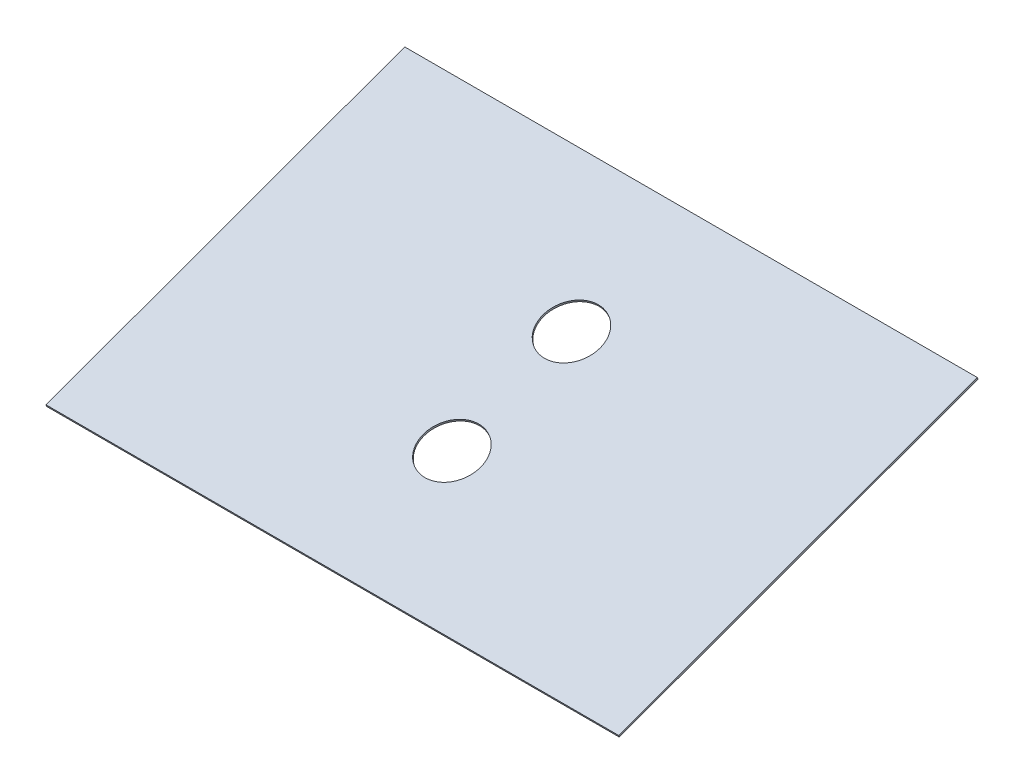
ISO-10303-21;
HEADER;
FILE_DESCRIPTION(('STEP AP214'),'2;1');
FILE_NAME('part.step','',(''),(''),'','','');
FILE_SCHEMA(('AUTOMOTIVE_DESIGN { 1 0 10303 214 1 1 1 1 }'));
ENDSEC;
DATA;
#1=APPLICATION_CONTEXT('core data for automotive mechanical design processes');
#2=APPLICATION_PROTOCOL_DEFINITION('international standard','automotive_design',2000,#1);
#3=PRODUCT_CONTEXT('',#1,'mechanical');
#4=PRODUCT('Part','Part','',(#3));
#5=PRODUCT_RELATED_PRODUCT_CATEGORY('part','',(#4));
#6=PRODUCT_DEFINITION_FORMATION('','',#4);
#7=PRODUCT_DEFINITION_CONTEXT('part definition',#1,'design');
#8=PRODUCT_DEFINITION('design','',#6,#7);
#9=PRODUCT_DEFINITION_SHAPE('','',#8);
#10=(LENGTH_UNIT() NAMED_UNIT(*) SI_UNIT(.MILLI.,.METRE.));
#11=(NAMED_UNIT(*) PLANE_ANGLE_UNIT() SI_UNIT($,.RADIAN.));
#12=(NAMED_UNIT(*) SI_UNIT($,.STERADIAN.) SOLID_ANGLE_UNIT());
#13=UNCERTAINTY_MEASURE_WITH_UNIT(LENGTH_MEASURE(1.E-05),#10,'distance_accuracy_value','');
#14=(GEOMETRIC_REPRESENTATION_CONTEXT(3) GLOBAL_UNCERTAINTY_ASSIGNED_CONTEXT((#13)) GLOBAL_UNIT_ASSIGNED_CONTEXT((#10,
#11,#12)) REPRESENTATION_CONTEXT('',''));
#15=CARTESIAN_POINT('',(0.,0.,0.));
#16=DIRECTION('',(0.,0.,1.));
#17=DIRECTION('',(1.,0.,0.));
#18=AXIS2_PLACEMENT_3D('',#15,#16,#17);
#19=CARTESIAN_POINT('',(0.,-22.480622248936,26.2341140516415));
#20=DIRECTION('',(-1.,0.,0.));
#21=DIRECTION('',(0.,0.342020143325666,-0.939692620785909));
#22=AXIS2_PLACEMENT_3D('',#19,#20,#21);
#23=PLANE('',#22);
#24=DIRECTION('',(0.,-0.939692620785909,-0.342020143325666));
#25=VECTOR('',#24,1.);
#26=CARTESIAN_POINT('',(0.,-29.3210251154493,45.0279664673597));
#27=LINE('',#26,#25);
#28=CARTESIAN_POINT('',(0.,-29.2270558533707,45.0621684816922));
#29=VERTEX_POINT('',#28);
#30=CARTESIAN_POINT('',(0.,-29.3210251154493,45.0279664673597));
#31=VERTEX_POINT('',#30);
#32=EDGE_CURVE('E11',#29,#31,#27,.T.);
#33=ORIENTED_EDGE('',*,*,#32,.F.);
#34=DIRECTION('',(0.,0.342020143325666,-0.939692620785909));
#35=VECTOR('',#34,1.);
#36=CARTESIAN_POINT('',(0.,-22.3866529868574,26.268316065974));
#37=LINE('',#36,#35);
#38=CARTESIAN_POINT('',(0.,-22.3866529868574,26.268316065974));
#39=VERTEX_POINT('',#38);
#40=EDGE_CURVE('E88',#29,#39,#37,.T.);
#41=ORIENTED_EDGE('',*,*,#40,.T.);
#42=DIRECTION('',(0.,-0.939692620785909,-0.342020143325666));
#43=VECTOR('',#42,1.);
#44=CARTESIAN_POINT('',(0.,-22.480622248936,26.2341140516415));
#45=LINE('',#44,#43);
#46=CARTESIAN_POINT('',(0.,-22.480622248936,26.2341140516415));
#47=VERTEX_POINT('',#46);
#48=EDGE_CURVE('E43',#39,#47,#45,.T.);
#49=ORIENTED_EDGE('',*,*,#48,.T.);
#50=DIRECTION('',(0.,0.342020143325666,-0.939692620785909));
#51=VECTOR('',#50,1.);
#52=CARTESIAN_POINT('',(0.,-22.480622248936,26.2341140516415));
#53=LINE('',#52,#51);
#54=EDGE_CURVE('E105',#31,#47,#53,.T.);
#55=ORIENTED_EDGE('',*,*,#54,.F.);
#56=EDGE_LOOP('',(#33,#41,#49,#55));
#57=FACE_BOUND('',#56,.T.);
#58=ADVANCED_FACE('F33',(#57),#23,.T.);
#59=CARTESIAN_POINT('',(0.,-22.480622248936,26.2341140516415));
#60=DIRECTION('',(0.,0.342020143325666,-0.939692620785909));
#61=DIRECTION('',(1.,0.,0.));
#62=AXIS2_PLACEMENT_3D('',#59,#60,#61);
#63=PLANE('',#62);
#64=ORIENTED_EDGE('',*,*,#48,.F.);
#65=DIRECTION('',(1.,0.,0.));
#66=VECTOR('',#65,1.);
#67=CARTESIAN_POINT('',(0.,-22.3866529868574,26.268316065974));
#68=LINE('',#67,#66);
#69=CARTESIAN_POINT('',(30.,-22.3866529868574,26.268316065974));
#70=VERTEX_POINT('',#69);
#71=EDGE_CURVE('E99',#39,#70,#68,.T.);
#72=ORIENTED_EDGE('',*,*,#71,.T.);
#73=DIRECTION('',(0.,-0.939692620785909,-0.342020143325666));
#74=VECTOR('',#73,1.);
#75=CARTESIAN_POINT('',(30.,-22.480622248936,26.2341140516415));
#76=LINE('',#75,#74);
#77=CARTESIAN_POINT('',(30.,-22.480622248936,26.2341140516415));
#78=VERTEX_POINT('',#77);
#79=EDGE_CURVE('E51',#70,#78,#76,.T.);
#80=ORIENTED_EDGE('',*,*,#79,.T.);
#81=DIRECTION('',(1.,0.,0.));
#82=VECTOR('',#81,1.);
#83=CARTESIAN_POINT('',(0.,-22.480622248936,26.2341140516415));
#84=LINE('',#83,#82);
#85=EDGE_CURVE('E82',#47,#78,#84,.T.);
#86=ORIENTED_EDGE('',*,*,#85,.F.);
#87=EDGE_LOOP('',(#64,#72,#80,#86));
#88=FACE_BOUND('',#87,.T.);
#89=ADVANCED_FACE('F109',(#88),#63,.T.);
#90=CARTESIAN_POINT('',(30.,-22.480622248936,26.2341140516415));
#91=DIRECTION('',(-1.,0.,0.));
#92=DIRECTION('',(0.,0.342020143325666,-0.939692620785909));
#93=AXIS2_PLACEMENT_3D('',#90,#91,#92);
#94=PLANE('',#93);
#95=ORIENTED_EDGE('',*,*,#79,.F.);
#96=DIRECTION('',(0.,0.342020143325666,-0.939692620785909));
#97=VECTOR('',#96,1.);
#98=CARTESIAN_POINT('',(30.,-22.3866529868574,26.268316065974));
#99=LINE('',#98,#97);
#100=CARTESIAN_POINT('',(30.,-29.2270558533707,45.0621684816922));
#101=VERTEX_POINT('',#100);
#102=EDGE_CURVE('E87',#101,#70,#99,.T.);
#103=ORIENTED_EDGE('',*,*,#102,.F.);
#104=DIRECTION('',(0.,-0.939692620785909,-0.342020143325666));
#105=VECTOR('',#104,1.);
#106=CARTESIAN_POINT('',(30.,-29.3210251154493,45.0279664673597));
#107=LINE('',#106,#105);
#108=CARTESIAN_POINT('',(30.,-29.3210251154493,45.0279664673597));
#109=VERTEX_POINT('',#108);
#110=EDGE_CURVE('E37',#101,#109,#107,.T.);
#111=ORIENTED_EDGE('',*,*,#110,.T.);
#112=DIRECTION('',(0.,0.342020143325666,-0.939692620785909));
#113=VECTOR('',#112,1.);
#114=CARTESIAN_POINT('',(30.,-22.480622248936,26.2341140516415));
#115=LINE('',#114,#113);
#116=EDGE_CURVE('E101',#109,#78,#115,.T.);
#117=ORIENTED_EDGE('',*,*,#116,.T.);
#118=EDGE_LOOP('',(#95,#103,#111,#117));
#119=FACE_BOUND('',#118,.T.);
#120=ADVANCED_FACE('F90',(#119),#94,.F.);
#121=CARTESIAN_POINT('',(0.,-29.3210251154493,45.0279664673597));
#122=DIRECTION('',(0.,0.342020143325666,-0.939692620785909));
#123=DIRECTION('',(1.,0.,0.));
#124=AXIS2_PLACEMENT_3D('',#121,#122,#123);
#125=PLANE('',#124);
#126=DIRECTION('',(1.,0.,0.));
#127=VECTOR('',#126,1.);
#128=CARTESIAN_POINT('',(0.,-29.2270558533707,45.0621684816922));
#129=LINE('',#128,#127);
#130=EDGE_CURVE('E76',#29,#101,#129,.T.);
#131=ORIENTED_EDGE('',*,*,#130,.F.);
#132=ORIENTED_EDGE('',*,*,#32,.T.);
#133=DIRECTION('',(1.,0.,0.));
#134=VECTOR('',#133,1.);
#135=CARTESIAN_POINT('',(0.,-29.3210251154493,45.0279664673597));
#136=LINE('',#135,#134);
#137=EDGE_CURVE('E78',#31,#109,#136,.T.);
#138=ORIENTED_EDGE('',*,*,#137,.T.);
#139=ORIENTED_EDGE('',*,*,#110,.F.);
#140=EDGE_LOOP('',(#131,#132,#138,#139));
#141=FACE_BOUND('',#140,.T.);
#142=ADVANCED_FACE('F35',(#141),#125,.F.);
#143=CARTESIAN_POINT('',(0.,-22.480622248936,26.2341140516415));
#144=DIRECTION('',(0.,-0.939692620785909,-0.342020143325666));
#145=DIRECTION('',(0.,0.342020143325666,-0.939692620785909));
#146=AXIS2_PLACEMENT_3D('',#143,#144,#145);
#147=PLANE('',#146);
#148=CARTESIAN_POINT('',(15.,-27.0408908266115,38.7633489954536));
#149=DIRECTION('',(0.,-0.939692620785909,-0.342020143325666));
#150=DIRECTION('',(0.,0.342020143325666,-0.939692620785909));
#151=AXIS2_PLACEMENT_3D('',#148,#149,#150);
#152=CIRCLE('',#151,1.5);
#153=CARTESIAN_POINT('',(15.,-26.527860611623,37.3538100642748));
#154=VERTEX_POINT('',#153);
#155=EDGE_CURVE('E94',#154,#154,#152,.F.);
#156=ORIENTED_EDGE('',*,*,#155,.T.);
#157=EDGE_LOOP('',(#156));
#158=FACE_BOUND('',#157,.T.);
#159=CARTESIAN_POINT('',(15.,-24.7607565377738,32.4987315235475));
#160=DIRECTION('',(0.,-0.939692620785909,-0.342020143325666));
#161=DIRECTION('',(0.,0.342020143325666,-0.939692620785909));
#162=AXIS2_PLACEMENT_3D('',#159,#160,#161);
#163=CIRCLE('',#162,1.5);
#164=CARTESIAN_POINT('',(15.,-24.2477263227853,31.0891925923687));
#165=VERTEX_POINT('',#164);
#166=EDGE_CURVE('E113',#165,#165,#163,.F.);
#167=ORIENTED_EDGE('',*,*,#166,.T.);
#168=EDGE_LOOP('',(#167));
#169=FACE_BOUND('',#168,.T.);
#170=ORIENTED_EDGE('',*,*,#116,.F.);
#171=ORIENTED_EDGE('',*,*,#137,.F.);
#172=ORIENTED_EDGE('',*,*,#54,.T.);
#173=ORIENTED_EDGE('',*,*,#85,.T.);
#174=EDGE_LOOP('',(#170,#171,#172,#173));
#175=FACE_BOUND('',#174,.T.);
#176=ADVANCED_FACE('F108',(#158,#169,#175),#147,.T.);
#177=CARTESIAN_POINT('',(0.,-22.3866529868574,26.268316065974));
#178=DIRECTION('',(0.,-0.939692620785909,-0.342020143325666));
#179=DIRECTION('',(0.,0.342020143325666,-0.939692620785909));
#180=AXIS2_PLACEMENT_3D('',#177,#178,#179);
#181=PLANE('',#180);
#182=CARTESIAN_POINT('',(15.,-26.9469215645329,38.7975510097862));
#183=DIRECTION('',(0.,0.939692620785909,0.342020143325666));
#184=DIRECTION('',(0.,-0.342020143325666,0.939692620785909));
#185=AXIS2_PLACEMENT_3D('',#182,#183,#184);
#186=CIRCLE('',#185,1.5);
#187=CARTESIAN_POINT('',(15.,-27.4599517795214,40.207089940965));
#188=VERTEX_POINT('',#187);
#189=EDGE_CURVE('E91',#188,#188,#186,.T.);
#190=ORIENTED_EDGE('',*,*,#189,.F.);
#191=EDGE_LOOP('',(#190));
#192=FACE_BOUND('',#191,.T.);
#193=CARTESIAN_POINT('',(15.,-24.6667872756952,32.5329335378801));
#194=DIRECTION('',(0.,0.939692620785909,0.342020143325666));
#195=DIRECTION('',(0.,-0.342020143325666,0.939692620785909));
#196=AXIS2_PLACEMENT_3D('',#193,#194,#195);
#197=CIRCLE('',#196,1.5);
#198=CARTESIAN_POINT('',(15.,-25.1798174906837,33.942472469059));
#199=VERTEX_POINT('',#198);
#200=EDGE_CURVE('E116',#199,#199,#197,.T.);
#201=ORIENTED_EDGE('',*,*,#200,.F.);
#202=EDGE_LOOP('',(#201));
#203=FACE_BOUND('',#202,.T.);
#204=ORIENTED_EDGE('',*,*,#102,.T.);
#205=ORIENTED_EDGE('',*,*,#71,.F.);
#206=ORIENTED_EDGE('',*,*,#40,.F.);
#207=ORIENTED_EDGE('',*,*,#130,.T.);
#208=EDGE_LOOP('',(#204,#205,#206,#207));
#209=FACE_BOUND('',#208,.T.);
#210=ADVANCED_FACE('F85',(#192,#203,#209),#181,.F.);
#211=CARTESIAN_POINT('',(15.,-60.0939961942015,19.6384840084138));
#212=DIRECTION('',(0.,0.939692620785909,0.342020143325666));
#213=DIRECTION('',(0.,-0.342020143325666,0.939692620785909));
#214=AXIS2_PLACEMENT_3D('',#211,#212,#213);
#215=CYLINDRICAL_SURFACE('',#214,1.5);
#216=ORIENTED_EDGE('',*,*,#166,.F.);
#217=EDGE_LOOP('',(#216));
#218=FACE_BOUND('',#217,.T.);
#219=ORIENTED_EDGE('',*,*,#200,.T.);
#220=EDGE_LOOP('',(#219));
#221=FACE_BOUND('',#220,.T.);
#222=ADVANCED_FACE('F127',(#218,#221),#215,.F.);
#223=CARTESIAN_POINT('',(15.,-62.3741304830393,25.9031014803198));
#224=DIRECTION('',(0.,0.939692620785909,0.342020143325666));
#225=DIRECTION('',(0.,-0.342020143325666,0.939692620785909));
#226=AXIS2_PLACEMENT_3D('',#223,#224,#225);
#227=CYLINDRICAL_SURFACE('',#226,1.5);
#228=ORIENTED_EDGE('',*,*,#155,.F.);
#229=EDGE_LOOP('',(#228));
#230=FACE_BOUND('',#229,.T.);
#231=ORIENTED_EDGE('',*,*,#189,.T.);
#232=EDGE_LOOP('',(#231));
#233=FACE_BOUND('',#232,.T.);
#234=ADVANCED_FACE('F124',(#230,#233),#227,.F.);
#235=CLOSED_SHELL('',(#58,#89,#120,#142,#176,#210,#222,#234));
#236=MANIFOLD_SOLID_BREP('B2',#235);
#237=ADVANCED_BREP_SHAPE_REPRESENTATION('',(#18,#236),#14);
#238=SHAPE_DEFINITION_REPRESENTATION(#9,#237);
ENDSEC;
END-ISO-10303-21;
